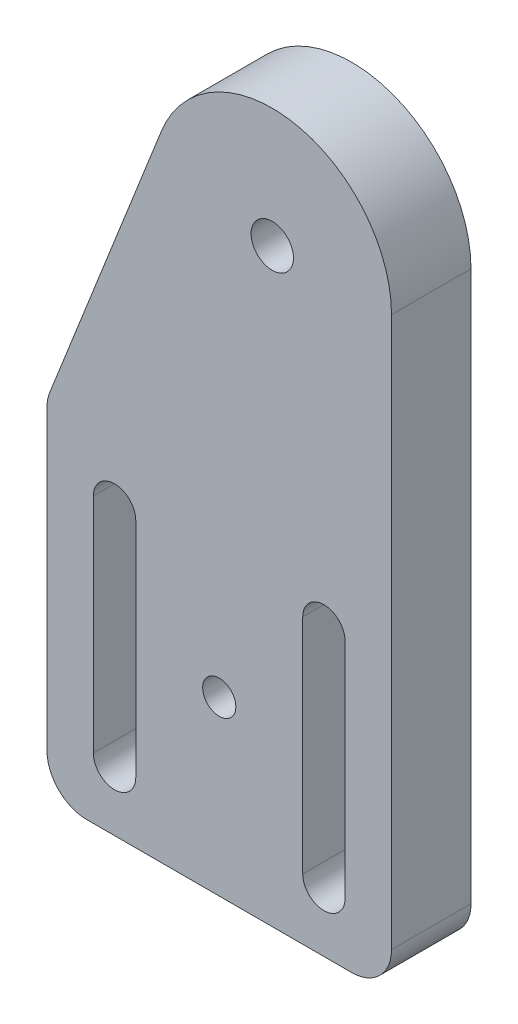
ISO-10303-21;
HEADER;
FILE_DESCRIPTION(('STEP AP214'),'2;1');
FILE_NAME('part.step','',(''),(''),'','','');
FILE_SCHEMA(('AUTOMOTIVE_DESIGN { 1 0 10303 214 1 1 1 1 }'));
ENDSEC;
DATA;
#1=APPLICATION_CONTEXT('core data for automotive mechanical design processes');
#2=APPLICATION_PROTOCOL_DEFINITION('international standard','automotive_design',2000,#1);
#3=PRODUCT_CONTEXT('',#1,'mechanical');
#4=PRODUCT('Part','Part','',(#3));
#5=PRODUCT_RELATED_PRODUCT_CATEGORY('part','',(#4));
#6=PRODUCT_DEFINITION_FORMATION('','',#4);
#7=PRODUCT_DEFINITION_CONTEXT('part definition',#1,'design');
#8=PRODUCT_DEFINITION('design','',#6,#7);
#9=PRODUCT_DEFINITION_SHAPE('','',#8);
#10=(LENGTH_UNIT() NAMED_UNIT(*) SI_UNIT(.MILLI.,.METRE.));
#11=(NAMED_UNIT(*) PLANE_ANGLE_UNIT() SI_UNIT($,.RADIAN.));
#12=(NAMED_UNIT(*) SI_UNIT($,.STERADIAN.) SOLID_ANGLE_UNIT());
#13=UNCERTAINTY_MEASURE_WITH_UNIT(LENGTH_MEASURE(1.E-05),#10,'distance_accuracy_value','');
#14=(GEOMETRIC_REPRESENTATION_CONTEXT(3) GLOBAL_UNCERTAINTY_ASSIGNED_CONTEXT((#13)) GLOBAL_UNIT_ASSIGNED_CONTEXT((#10,
#11,#12)) REPRESENTATION_CONTEXT('',''));
#15=CARTESIAN_POINT('',(0.,0.,0.));
#16=DIRECTION('',(0.,0.,1.));
#17=DIRECTION('',(1.,0.,0.));
#18=AXIS2_PLACEMENT_3D('',#15,#16,#17);
#19=CARTESIAN_POINT('',(4.,0.,6.));
#20=DIRECTION('',(0.,0.,-1.));
#21=DIRECTION('',(-1.,0.,0.));
#22=AXIS2_PLACEMENT_3D('',#19,#20,#21);
#23=PLANE('',#22);
#24=CARTESIAN_POINT('',(4.,0.,6.));
#25=DIRECTION('',(0.,0.,1.));
#26=DIRECTION('',(1.,0.,0.));
#27=AXIS2_PLACEMENT_3D('',#24,#25,#26);
#28=CIRCLE('',#27,1.6);
#29=CARTESIAN_POINT('',(5.6,0.,6.));
#30=VERTEX_POINT('',#29);
#31=EDGE_CURVE('E576',#30,#30,#28,.T.);
#32=ORIENTED_EDGE('',*,*,#31,.F.);
#33=EDGE_LOOP('',(#32));
#34=FACE_BOUND('',#33,.T.);
#35=CARTESIAN_POINT('',(0.,-31.5,6.));
#36=DIRECTION('',(0.,0.,1.));
#37=DIRECTION('',(1.,0.,0.));
#38=AXIS2_PLACEMENT_3D('',#35,#36,#37);
#39=CIRCLE('',#38,1.25);
#40=CARTESIAN_POINT('',(1.25,-31.5,6.));
#41=VERTEX_POINT('',#40);
#42=EDGE_CURVE('E580',#41,#41,#39,.T.);
#43=ORIENTED_EDGE('',*,*,#42,.F.);
#44=EDGE_LOOP('',(#43));
#45=FACE_BOUND('',#44,.T.);
#46=CARTESIAN_POINT('',(-7.9,-23.1,6.));
#47=DIRECTION('',(0.,0.,1.));
#48=DIRECTION('',(1.,0.,0.));
#49=AXIS2_PLACEMENT_3D('',#46,#47,#48);
#50=CIRCLE('',#49,1.6);
#51=CARTESIAN_POINT('',(-6.3,-23.1,6.));
#52=VERTEX_POINT('',#51);
#53=CARTESIAN_POINT('',(-9.5,-23.1,6.));
#54=VERTEX_POINT('',#53);
#55=EDGE_CURVE('E255',#52,#54,#50,.T.);
#56=ORIENTED_EDGE('',*,*,#55,.F.);
#57=DIRECTION('',(0.,-1.,0.));
#58=VECTOR('',#57,1.);
#59=CARTESIAN_POINT('',(-6.3,-23.1,6.));
#60=LINE('',#59,#58);
#61=CARTESIAN_POINT('',(-6.3,-39.9,6.));
#62=VERTEX_POINT('',#61);
#63=EDGE_CURVE('E263',#52,#62,#60,.T.);
#64=ORIENTED_EDGE('',*,*,#63,.T.);
#65=CARTESIAN_POINT('',(-7.9,-39.9,6.));
#66=DIRECTION('',(0.,0.,1.));
#67=DIRECTION('',(1.,0.,0.));
#68=AXIS2_PLACEMENT_3D('',#65,#66,#67);
#69=CIRCLE('',#68,1.6);
#70=CARTESIAN_POINT('',(-9.5,-39.9,6.));
#71=VERTEX_POINT('',#70);
#72=EDGE_CURVE('E260',#71,#62,#69,.T.);
#73=ORIENTED_EDGE('',*,*,#72,.F.);
#74=DIRECTION('',(0.,-1.,0.));
#75=VECTOR('',#74,1.);
#76=CARTESIAN_POINT('',(-9.5,-23.1,6.));
#77=LINE('',#76,#75);
#78=EDGE_CURVE('E257',#54,#71,#77,.T.);
#79=ORIENTED_EDGE('',*,*,#78,.F.);
#80=EDGE_LOOP('',(#56,#64,#73,#79));
#81=FACE_BOUND('',#80,.T.);
#82=DIRECTION('',(-1.,0.,0.));
#83=VECTOR('',#82,1.);
#84=CARTESIAN_POINT('',(13.,-44.5,6.));
#85=LINE('',#84,#83);
#86=CARTESIAN_POINT('',(10.,-44.5,6.));
#87=VERTEX_POINT('',#86);
#88=CARTESIAN_POINT('',(-9.99999999999999,-44.5,6.));
#89=VERTEX_POINT('',#88);
#90=EDGE_CURVE('E290',#87,#89,#85,.T.);
#91=ORIENTED_EDGE('',*,*,#90,.F.);
#92=CARTESIAN_POINT('',(10.,-41.5,6.));
#93=DIRECTION('',(0.,0.,-1.));
#94=DIRECTION('',(-1.,0.,0.));
#95=AXIS2_PLACEMENT_3D('',#92,#93,#94);
#96=CIRCLE('',#95,3.);
#97=CARTESIAN_POINT('',(13.,-41.5,6.));
#98=VERTEX_POINT('',#97);
#99=EDGE_CURVE('E335',#87,#98,#96,.F.);
#100=ORIENTED_EDGE('',*,*,#99,.T.);
#101=DIRECTION('',(0.,-1.,0.));
#102=VECTOR('',#101,1.);
#103=CARTESIAN_POINT('',(13.,-18.5,6.));
#104=LINE('',#103,#102);
#105=CARTESIAN_POINT('',(13.,0.,6.));
#106=VERTEX_POINT('',#105);
#107=EDGE_CURVE('E287',#106,#98,#104,.T.);
#108=ORIENTED_EDGE('',*,*,#107,.F.);
#109=CARTESIAN_POINT('',(4.,0.,6.));
#110=DIRECTION('',(0.,0.,-1.));
#111=DIRECTION('',(-1.,0.,0.));
#112=AXIS2_PLACEMENT_3D('',#109,#110,#111);
#113=CIRCLE('',#112,9.);
#114=CARTESIAN_POINT('',(-4.36856786884972,3.31165696056461,6.));
#115=VERTEX_POINT('',#114);
#116=EDGE_CURVE('E298',#115,#106,#113,.T.);
#117=ORIENTED_EDGE('',*,*,#116,.F.);
#118=DIRECTION('',(0.367961884507179,0.929840874316636,0.));
#119=VECTOR('',#118,1.);
#120=CARTESIAN_POINT('',(-13.,-18.5,6.));
#121=LINE('',#120,#119);
#122=CARTESIAN_POINT('',(-12.7895226229499,-17.9681229862646,6.));
#123=VERTEX_POINT('',#122);
#124=EDGE_CURVE('E296',#123,#115,#121,.T.);
#125=ORIENTED_EDGE('',*,*,#124,.F.);
#126=CARTESIAN_POINT('',(-10.,-19.0720086397861,6.));
#127=DIRECTION('',(0.,0.,-1.));
#128=DIRECTION('',(-1.,0.,0.));
#129=AXIS2_PLACEMENT_3D('',#126,#127,#128);
#130=CIRCLE('',#129,3.);
#131=CARTESIAN_POINT('',(-13.,-19.0720086397861,6.));
#132=VERTEX_POINT('',#131);
#133=EDGE_CURVE('E113',#123,#132,#130,.F.);
#134=ORIENTED_EDGE('',*,*,#133,.T.);
#135=DIRECTION('',(0.,1.,0.));
#136=VECTOR('',#135,1.);
#137=CARTESIAN_POINT('',(-13.,-44.5,6.));
#138=LINE('',#137,#136);
#139=CARTESIAN_POINT('',(-13.,-41.5,6.));
#140=VERTEX_POINT('',#139);
#141=EDGE_CURVE('E294',#140,#132,#138,.T.);
#142=ORIENTED_EDGE('',*,*,#141,.F.);
#143=CARTESIAN_POINT('',(-10.,-41.5,6.));
#144=DIRECTION('',(0.,0.,-1.));
#145=DIRECTION('',(-1.,0.,0.));
#146=AXIS2_PLACEMENT_3D('',#143,#144,#145);
#147=CIRCLE('',#146,3.);
#148=EDGE_CURVE('E333',#140,#89,#147,.F.);
#149=ORIENTED_EDGE('',*,*,#148,.T.);
#150=EDGE_LOOP('',(#91,#100,#108,#117,#125,#134,#142,#149));
#151=FACE_BOUND('',#150,.T.);
#152=CARTESIAN_POINT('',(7.9,-23.1,6.));
#153=DIRECTION('',(0.,0.,1.));
#154=DIRECTION('',(1.,0.,0.));
#155=AXIS2_PLACEMENT_3D('',#152,#153,#154);
#156=CIRCLE('',#155,1.6);
#157=CARTESIAN_POINT('',(9.5,-23.1,6.));
#158=VERTEX_POINT('',#157);
#159=CARTESIAN_POINT('',(6.3,-23.1,6.));
#160=VERTEX_POINT('',#159);
#161=EDGE_CURVE('E211',#158,#160,#156,.T.);
#162=ORIENTED_EDGE('',*,*,#161,.F.);
#163=DIRECTION('',(0.,-1.,0.));
#164=VECTOR('',#163,1.);
#165=CARTESIAN_POINT('',(9.5,-23.1,6.));
#166=LINE('',#165,#164);
#167=CARTESIAN_POINT('',(9.5,-39.9,6.));
#168=VERTEX_POINT('',#167);
#169=EDGE_CURVE('E237',#158,#168,#166,.T.);
#170=ORIENTED_EDGE('',*,*,#169,.T.);
#171=CARTESIAN_POINT('',(7.9,-39.9,6.));
#172=DIRECTION('',(0.,0.,1.));
#173=DIRECTION('',(1.,0.,0.));
#174=AXIS2_PLACEMENT_3D('',#171,#172,#173);
#175=CIRCLE('',#174,1.6);
#176=CARTESIAN_POINT('',(6.3,-39.9,6.));
#177=VERTEX_POINT('',#176);
#178=EDGE_CURVE('E235',#177,#168,#175,.T.);
#179=ORIENTED_EDGE('',*,*,#178,.F.);
#180=DIRECTION('',(0.,-1.,0.));
#181=VECTOR('',#180,1.);
#182=CARTESIAN_POINT('',(6.3,-23.1,6.));
#183=LINE('',#182,#181);
#184=EDGE_CURVE('E222',#160,#177,#183,.T.);
#185=ORIENTED_EDGE('',*,*,#184,.F.);
#186=EDGE_LOOP('',(#162,#170,#179,#185));
#187=FACE_BOUND('',#186,.T.);
#188=ADVANCED_FACE('F98',(#34,#45,#81,#151,#187),#23,.F.);
#189=CARTESIAN_POINT('',(4.,0.,0.));
#190=DIRECTION('',(0.,0.,-1.));
#191=DIRECTION('',(-1.,0.,0.));
#192=AXIS2_PLACEMENT_3D('',#189,#190,#191);
#193=PLANE('',#192);
#194=CARTESIAN_POINT('',(0.,-31.5,0.));
#195=DIRECTION('',(0.,0.,1.));
#196=DIRECTION('',(1.,0.,0.));
#197=AXIS2_PLACEMENT_3D('',#194,#195,#196);
#198=CIRCLE('',#197,1.25);
#199=CARTESIAN_POINT('',(1.25,-31.5,0.));
#200=VERTEX_POINT('',#199);
#201=EDGE_CURVE('E583',#200,#200,#198,.T.);
#202=ORIENTED_EDGE('',*,*,#201,.T.);
#203=EDGE_LOOP('',(#202));
#204=FACE_BOUND('',#203,.T.);
#205=CARTESIAN_POINT('',(4.,0.,0.));
#206=DIRECTION('',(0.,0.,1.));
#207=DIRECTION('',(1.,0.,0.));
#208=AXIS2_PLACEMENT_3D('',#205,#206,#207);
#209=CIRCLE('',#208,3.);
#210=CARTESIAN_POINT('',(7.,0.,0.));
#211=VERTEX_POINT('',#210);
#212=EDGE_CURVE('E589',#211,#211,#209,.T.);
#213=ORIENTED_EDGE('',*,*,#212,.T.);
#214=EDGE_LOOP('',(#213));
#215=FACE_BOUND('',#214,.T.);
#216=DIRECTION('',(0.,1.,0.));
#217=VECTOR('',#216,1.);
#218=CARTESIAN_POINT('',(13.,-18.5,0.));
#219=LINE('',#218,#217);
#220=CARTESIAN_POINT('',(13.,-41.5,0.));
#221=VERTEX_POINT('',#220);
#222=CARTESIAN_POINT('',(13.,0.,0.));
#223=VERTEX_POINT('',#222);
#224=EDGE_CURVE('E291',#221,#223,#219,.T.);
#225=ORIENTED_EDGE('',*,*,#224,.F.);
#226=CARTESIAN_POINT('',(10.,-41.5,0.));
#227=DIRECTION('',(0.,0.,-1.));
#228=DIRECTION('',(-1.,0.,0.));
#229=AXIS2_PLACEMENT_3D('',#226,#227,#228);
#230=CIRCLE('',#229,3.);
#231=CARTESIAN_POINT('',(10.,-44.5,0.));
#232=VERTEX_POINT('',#231);
#233=EDGE_CURVE('E325',#221,#232,#230,.T.);
#234=ORIENTED_EDGE('',*,*,#233,.T.);
#235=DIRECTION('',(-1.,0.,0.));
#236=VECTOR('',#235,1.);
#237=CARTESIAN_POINT('',(13.,-44.5,0.));
#238=LINE('',#237,#236);
#239=CARTESIAN_POINT('',(-9.99999999999999,-44.5,0.));
#240=VERTEX_POINT('',#239);
#241=EDGE_CURVE('E286',#232,#240,#238,.T.);
#242=ORIENTED_EDGE('',*,*,#241,.T.);
#243=CARTESIAN_POINT('',(-10.,-41.5,0.));
#244=DIRECTION('',(0.,0.,-1.));
#245=DIRECTION('',(-1.,0.,0.));
#246=AXIS2_PLACEMENT_3D('',#243,#244,#245);
#247=CIRCLE('',#246,3.);
#248=CARTESIAN_POINT('',(-13.,-41.5,0.));
#249=VERTEX_POINT('',#248);
#250=EDGE_CURVE('E323',#240,#249,#247,.T.);
#251=ORIENTED_EDGE('',*,*,#250,.T.);
#252=DIRECTION('',(0.,1.,0.));
#253=VECTOR('',#252,1.);
#254=CARTESIAN_POINT('',(-13.,-44.5,0.));
#255=LINE('',#254,#253);
#256=CARTESIAN_POINT('',(-13.,-19.0720086397861,0.));
#257=VERTEX_POINT('',#256);
#258=EDGE_CURVE('E304',#249,#257,#255,.T.);
#259=ORIENTED_EDGE('',*,*,#258,.T.);
#260=CARTESIAN_POINT('',(-10.,-19.0720086397861,0.));
#261=DIRECTION('',(0.,0.,-1.));
#262=DIRECTION('',(-1.,0.,0.));
#263=AXIS2_PLACEMENT_3D('',#260,#261,#262);
#264=CIRCLE('',#263,3.);
#265=CARTESIAN_POINT('',(-12.7895226229499,-17.9681229862646,0.));
#266=VERTEX_POINT('',#265);
#267=EDGE_CURVE('E321',#257,#266,#264,.T.);
#268=ORIENTED_EDGE('',*,*,#267,.T.);
#269=DIRECTION('',(0.367961884507179,0.929840874316636,0.));
#270=VECTOR('',#269,1.);
#271=CARTESIAN_POINT('',(-13.,-18.5,0.));
#272=LINE('',#271,#270);
#273=CARTESIAN_POINT('',(-4.36856786884972,3.31165696056461,0.));
#274=VERTEX_POINT('',#273);
#275=EDGE_CURVE('E307',#266,#274,#272,.T.);
#276=ORIENTED_EDGE('',*,*,#275,.T.);
#277=CARTESIAN_POINT('',(4.,0.,0.));
#278=DIRECTION('',(0.,0.,-1.));
#279=DIRECTION('',(-1.,0.,0.));
#280=AXIS2_PLACEMENT_3D('',#277,#278,#279);
#281=CIRCLE('',#280,9.);
#282=EDGE_CURVE('E309',#274,#223,#281,.T.);
#283=ORIENTED_EDGE('',*,*,#282,.T.);
#284=EDGE_LOOP('',(#225,#234,#242,#251,#259,#268,#276,#283));
#285=FACE_BOUND('',#284,.T.);
#286=DIRECTION('',(0.,-1.,0.));
#287=VECTOR('',#286,1.);
#288=CARTESIAN_POINT('',(-6.3,-23.1,0.));
#289=LINE('',#288,#287);
#290=CARTESIAN_POINT('',(-6.3,-23.1,0.));
#291=VERTEX_POINT('',#290);
#292=CARTESIAN_POINT('',(-6.3,-39.9,0.));
#293=VERTEX_POINT('',#292);
#294=EDGE_CURVE('E258',#291,#293,#289,.T.);
#295=ORIENTED_EDGE('',*,*,#294,.F.);
#296=CARTESIAN_POINT('',(-7.9,-23.1,0.));
#297=DIRECTION('',(0.,0.,1.));
#298=DIRECTION('',(1.,0.,0.));
#299=AXIS2_PLACEMENT_3D('',#296,#297,#298);
#300=CIRCLE('',#299,1.6);
#301=CARTESIAN_POINT('',(-9.5,-23.1,0.));
#302=VERTEX_POINT('',#301);
#303=EDGE_CURVE('E230',#291,#302,#300,.T.);
#304=ORIENTED_EDGE('',*,*,#303,.T.);
#305=DIRECTION('',(0.,-1.,0.));
#306=VECTOR('',#305,1.);
#307=CARTESIAN_POINT('',(-9.5,-23.1,0.));
#308=LINE('',#307,#306);
#309=CARTESIAN_POINT('',(-9.5,-39.9,0.));
#310=VERTEX_POINT('',#309);
#311=EDGE_CURVE('E269',#302,#310,#308,.T.);
#312=ORIENTED_EDGE('',*,*,#311,.T.);
#313=CARTESIAN_POINT('',(-7.9,-39.9,0.));
#314=DIRECTION('',(0.,0.,1.));
#315=DIRECTION('',(1.,0.,0.));
#316=AXIS2_PLACEMENT_3D('',#313,#314,#315);
#317=CIRCLE('',#316,1.6);
#318=EDGE_CURVE('E272',#310,#293,#317,.T.);
#319=ORIENTED_EDGE('',*,*,#318,.T.);
#320=EDGE_LOOP('',(#295,#304,#312,#319));
#321=FACE_BOUND('',#320,.T.);
#322=DIRECTION('',(0.,-1.,0.));
#323=VECTOR('',#322,1.);
#324=CARTESIAN_POINT('',(9.5,-23.1,0.));
#325=LINE('',#324,#323);
#326=CARTESIAN_POINT('',(9.5,-23.1,0.));
#327=VERTEX_POINT('',#326);
#328=CARTESIAN_POINT('',(9.5,-39.9,0.));
#329=VERTEX_POINT('',#328);
#330=EDGE_CURVE('E223',#327,#329,#325,.T.);
#331=ORIENTED_EDGE('',*,*,#330,.F.);
#332=CARTESIAN_POINT('',(7.9,-23.1,0.));
#333=DIRECTION('',(0.,0.,1.));
#334=DIRECTION('',(1.,0.,0.));
#335=AXIS2_PLACEMENT_3D('',#332,#333,#334);
#336=CIRCLE('',#335,1.6);
#337=CARTESIAN_POINT('',(6.3,-23.1,0.));
#338=VERTEX_POINT('',#337);
#339=EDGE_CURVE('E242',#327,#338,#336,.T.);
#340=ORIENTED_EDGE('',*,*,#339,.T.);
#341=DIRECTION('',(0.,-1.,0.));
#342=VECTOR('',#341,1.);
#343=CARTESIAN_POINT('',(6.3,-23.1,0.));
#344=LINE('',#343,#342);
#345=CARTESIAN_POINT('',(6.3,-39.9,0.));
#346=VERTEX_POINT('',#345);
#347=EDGE_CURVE('E229',#338,#346,#344,.T.);
#348=ORIENTED_EDGE('',*,*,#347,.T.);
#349=CARTESIAN_POINT('',(7.9,-39.9,0.));
#350=DIRECTION('',(0.,0.,1.));
#351=DIRECTION('',(1.,0.,0.));
#352=AXIS2_PLACEMENT_3D('',#349,#350,#351);
#353=CIRCLE('',#352,1.6);
#354=EDGE_CURVE('E246',#346,#329,#353,.T.);
#355=ORIENTED_EDGE('',*,*,#354,.T.);
#356=EDGE_LOOP('',(#331,#340,#348,#355));
#357=FACE_BOUND('',#356,.T.);
#358=ADVANCED_FACE('F344',(#204,#215,#285,#321,#357),#193,.T.);
#359=CARTESIAN_POINT('',(13.,-18.5,6.));
#360=DIRECTION('',(-1.,0.,0.));
#361=DIRECTION('',(0.,-1.,0.));
#362=AXIS2_PLACEMENT_3D('',#359,#360,#361);
#363=PLANE('',#362);
#364=ORIENTED_EDGE('',*,*,#107,.T.);
#365=DIRECTION('',(0.,0.,-1.));
#366=VECTOR('',#365,1.);
#367=CARTESIAN_POINT('',(13.,-41.5,0.));
#368=LINE('',#367,#366);
#369=EDGE_CURVE('E316',#98,#221,#368,.T.);
#370=ORIENTED_EDGE('',*,*,#369,.T.);
#371=ORIENTED_EDGE('',*,*,#224,.T.);
#372=DIRECTION('',(0.,0.,-1.));
#373=VECTOR('',#372,1.);
#374=CARTESIAN_POINT('',(13.,0.,6.));
#375=LINE('',#374,#373);
#376=EDGE_CURVE('E313',#106,#223,#375,.T.);
#377=ORIENTED_EDGE('',*,*,#376,.F.);
#378=EDGE_LOOP('',(#364,#370,#371,#377));
#379=FACE_BOUND('',#378,.T.);
#380=ADVANCED_FACE('F361',(#379),#363,.F.);
#381=CARTESIAN_POINT('',(4.,0.,6.));
#382=DIRECTION('',(0.,0.,-1.));
#383=DIRECTION('',(-1.,0.,0.));
#384=AXIS2_PLACEMENT_3D('',#381,#382,#383);
#385=CYLINDRICAL_SURFACE('',#384,9.);
#386=ORIENTED_EDGE('',*,*,#282,.F.);
#387=DIRECTION('',(0.,0.,-1.));
#388=VECTOR('',#387,1.);
#389=CARTESIAN_POINT('',(-4.36856786884972,3.31165696056461,6.));
#390=LINE('',#389,#388);
#391=EDGE_CURVE('E301',#115,#274,#390,.T.);
#392=ORIENTED_EDGE('',*,*,#391,.F.);
#393=ORIENTED_EDGE('',*,*,#116,.T.);
#394=ORIENTED_EDGE('',*,*,#376,.T.);
#395=EDGE_LOOP('',(#386,#392,#393,#394));
#396=FACE_BOUND('',#395,.T.);
#397=ADVANCED_FACE('F366',(#396),#385,.T.);
#398=CARTESIAN_POINT('',(-13.,-18.5,6.));
#399=DIRECTION('',(-0.929840874316636,0.367961884507179,0.));
#400=DIRECTION('',(-0.367961884507179,-0.929840874316636,0.));
#401=AXIS2_PLACEMENT_3D('',#398,#399,#400);
#402=PLANE('',#401);
#403=ORIENTED_EDGE('',*,*,#275,.F.);
#404=DIRECTION('',(0.,0.,-1.));
#405=VECTOR('',#404,1.);
#406=CARTESIAN_POINT('',(-12.7895226229499,-17.9681229862646,6.));
#407=LINE('',#406,#405);
#408=EDGE_CURVE('E12',#266,#123,#407,.F.);
#409=ORIENTED_EDGE('',*,*,#408,.T.);
#410=ORIENTED_EDGE('',*,*,#124,.T.);
#411=ORIENTED_EDGE('',*,*,#391,.T.);
#412=EDGE_LOOP('',(#403,#409,#410,#411));
#413=FACE_BOUND('',#412,.T.);
#414=ADVANCED_FACE('F370',(#413),#402,.T.);
#415=CARTESIAN_POINT('',(-13.,-44.5,6.));
#416=DIRECTION('',(-1.,0.,0.));
#417=DIRECTION('',(0.,-1.,0.));
#418=AXIS2_PLACEMENT_3D('',#415,#416,#417);
#419=PLANE('',#418);
#420=ORIENTED_EDGE('',*,*,#258,.F.);
#421=DIRECTION('',(0.,0.,-1.));
#422=VECTOR('',#421,1.);
#423=CARTESIAN_POINT('',(-13.,-41.5,6.));
#424=LINE('',#423,#422);
#425=EDGE_CURVE('E106',#249,#140,#424,.F.);
#426=ORIENTED_EDGE('',*,*,#425,.T.);
#427=ORIENTED_EDGE('',*,*,#141,.T.);
#428=DIRECTION('',(0.,0.,-1.));
#429=VECTOR('',#428,1.);
#430=CARTESIAN_POINT('',(-13.,-19.0720086397861,6.));
#431=LINE('',#430,#429);
#432=EDGE_CURVE('E337',#132,#257,#431,.T.);
#433=ORIENTED_EDGE('',*,*,#432,.T.);
#434=EDGE_LOOP('',(#420,#426,#427,#433));
#435=FACE_BOUND('',#434,.T.);
#436=ADVANCED_FACE('F340',(#435),#419,.T.);
#437=CARTESIAN_POINT('',(13.,-44.5,6.));
#438=DIRECTION('',(0.,-1.,0.));
#439=DIRECTION('',(1.,0.,0.));
#440=AXIS2_PLACEMENT_3D('',#437,#438,#439);
#441=PLANE('',#440);
#442=ORIENTED_EDGE('',*,*,#241,.F.);
#443=DIRECTION('',(0.,0.,-1.));
#444=VECTOR('',#443,1.);
#445=CARTESIAN_POINT('',(10.,-44.5,6.));
#446=LINE('',#445,#444);
#447=EDGE_CURVE('E330',#232,#87,#446,.F.);
#448=ORIENTED_EDGE('',*,*,#447,.T.);
#449=ORIENTED_EDGE('',*,*,#90,.T.);
#450=DIRECTION('',(0.,0.,-1.));
#451=VECTOR('',#450,1.);
#452=CARTESIAN_POINT('',(-10.,-44.5,6.));
#453=LINE('',#452,#451);
#454=EDGE_CURVE('E327',#89,#240,#453,.T.);
#455=ORIENTED_EDGE('',*,*,#454,.T.);
#456=EDGE_LOOP('',(#442,#448,#449,#455));
#457=FACE_BOUND('',#456,.T.);
#458=ADVANCED_FACE('F353',(#457),#441,.T.);
#459=CARTESIAN_POINT('',(-7.9,-23.1,6.));
#460=DIRECTION('',(0.,0.,-1.));
#461=DIRECTION('',(-1.,0.,0.));
#462=AXIS2_PLACEMENT_3D('',#459,#460,#461);
#463=CYLINDRICAL_SURFACE('',#462,1.6);
#464=ORIENTED_EDGE('',*,*,#303,.F.);
#465=DIRECTION('',(0.,0.,-1.));
#466=VECTOR('',#465,1.);
#467=CARTESIAN_POINT('',(-6.3,-23.1,6.));
#468=LINE('',#467,#466);
#469=EDGE_CURVE('E266',#52,#291,#468,.T.);
#470=ORIENTED_EDGE('',*,*,#469,.F.);
#471=ORIENTED_EDGE('',*,*,#55,.T.);
#472=DIRECTION('',(0.,0.,-1.));
#473=VECTOR('',#472,1.);
#474=CARTESIAN_POINT('',(-9.5,-23.1,6.));
#475=LINE('',#474,#473);
#476=EDGE_CURVE('E283',#54,#302,#475,.T.);
#477=ORIENTED_EDGE('',*,*,#476,.T.);
#478=EDGE_LOOP('',(#464,#470,#471,#477));
#479=FACE_BOUND('',#478,.T.);
#480=ADVANCED_FACE('F390',(#479),#463,.F.);
#481=CARTESIAN_POINT('',(-9.5,-23.1,6.));
#482=DIRECTION('',(1.,0.,0.));
#483=DIRECTION('',(0.,0.,-1.));
#484=AXIS2_PLACEMENT_3D('',#481,#482,#483);
#485=PLANE('',#484);
#486=ORIENTED_EDGE('',*,*,#311,.F.);
#487=ORIENTED_EDGE('',*,*,#476,.F.);
#488=ORIENTED_EDGE('',*,*,#78,.T.);
#489=DIRECTION('',(0.,0.,-1.));
#490=VECTOR('',#489,1.);
#491=CARTESIAN_POINT('',(-9.5,-39.9,6.));
#492=LINE('',#491,#490);
#493=EDGE_CURVE('E281',#71,#310,#492,.T.);
#494=ORIENTED_EDGE('',*,*,#493,.T.);
#495=EDGE_LOOP('',(#486,#487,#488,#494));
#496=FACE_BOUND('',#495,.T.);
#497=ADVANCED_FACE('F412',(#496),#485,.T.);
#498=CARTESIAN_POINT('',(-7.9,-39.9,6.));
#499=DIRECTION('',(0.,0.,-1.));
#500=DIRECTION('',(-1.,0.,0.));
#501=AXIS2_PLACEMENT_3D('',#498,#499,#500);
#502=CYLINDRICAL_SURFACE('',#501,1.6);
#503=ORIENTED_EDGE('',*,*,#318,.F.);
#504=ORIENTED_EDGE('',*,*,#493,.F.);
#505=ORIENTED_EDGE('',*,*,#72,.T.);
#506=DIRECTION('',(0.,0.,-1.));
#507=VECTOR('',#506,1.);
#508=CARTESIAN_POINT('',(-6.3,-39.9,6.));
#509=LINE('',#508,#507);
#510=EDGE_CURVE('E279',#62,#293,#509,.T.);
#511=ORIENTED_EDGE('',*,*,#510,.T.);
#512=EDGE_LOOP('',(#503,#504,#505,#511));
#513=FACE_BOUND('',#512,.T.);
#514=ADVANCED_FACE('F423',(#513),#502,.F.);
#515=CARTESIAN_POINT('',(-6.3,-23.1,6.));
#516=DIRECTION('',(1.,0.,0.));
#517=DIRECTION('',(0.,0.,-1.));
#518=AXIS2_PLACEMENT_3D('',#515,#516,#517);
#519=PLANE('',#518);
#520=ORIENTED_EDGE('',*,*,#294,.T.);
#521=ORIENTED_EDGE('',*,*,#510,.F.);
#522=ORIENTED_EDGE('',*,*,#63,.F.);
#523=ORIENTED_EDGE('',*,*,#469,.T.);
#524=EDGE_LOOP('',(#520,#521,#522,#523));
#525=FACE_BOUND('',#524,.T.);
#526=ADVANCED_FACE('F432',(#525),#519,.F.);
#527=CARTESIAN_POINT('',(7.9,-23.1,6.));
#528=DIRECTION('',(0.,0.,-1.));
#529=DIRECTION('',(-1.,0.,0.));
#530=AXIS2_PLACEMENT_3D('',#527,#528,#529);
#531=CYLINDRICAL_SURFACE('',#530,1.6);
#532=ORIENTED_EDGE('',*,*,#339,.F.);
#533=DIRECTION('',(0.,0.,-1.));
#534=VECTOR('',#533,1.);
#535=CARTESIAN_POINT('',(9.5,-23.1,6.));
#536=LINE('',#535,#534);
#537=EDGE_CURVE('E217',#158,#327,#536,.T.);
#538=ORIENTED_EDGE('',*,*,#537,.F.);
#539=ORIENTED_EDGE('',*,*,#161,.T.);
#540=DIRECTION('',(0.,0.,-1.));
#541=VECTOR('',#540,1.);
#542=CARTESIAN_POINT('',(6.3,-23.1,6.));
#543=LINE('',#542,#541);
#544=EDGE_CURVE('E214',#160,#338,#543,.T.);
#545=ORIENTED_EDGE('',*,*,#544,.T.);
#546=EDGE_LOOP('',(#532,#538,#539,#545));
#547=FACE_BOUND('',#546,.T.);
#548=ADVANCED_FACE('F213',(#547),#531,.F.);
#549=CARTESIAN_POINT('',(6.3,-23.1,6.));
#550=DIRECTION('',(1.,0.,0.));
#551=DIRECTION('',(0.,0.,-1.));
#552=AXIS2_PLACEMENT_3D('',#549,#550,#551);
#553=PLANE('',#552);
#554=ORIENTED_EDGE('',*,*,#347,.F.);
#555=ORIENTED_EDGE('',*,*,#544,.F.);
#556=ORIENTED_EDGE('',*,*,#184,.T.);
#557=DIRECTION('',(0.,0.,-1.));
#558=VECTOR('',#557,1.);
#559=CARTESIAN_POINT('',(6.3,-39.9,6.));
#560=LINE('',#559,#558);
#561=EDGE_CURVE('E231',#177,#346,#560,.T.);
#562=ORIENTED_EDGE('',*,*,#561,.T.);
#563=EDGE_LOOP('',(#554,#555,#556,#562));
#564=FACE_BOUND('',#563,.T.);
#565=ADVANCED_FACE('F226',(#564),#553,.T.);
#566=CARTESIAN_POINT('',(7.9,-39.9,6.));
#567=DIRECTION('',(0.,0.,-1.));
#568=DIRECTION('',(-1.,0.,0.));
#569=AXIS2_PLACEMENT_3D('',#566,#567,#568);
#570=CYLINDRICAL_SURFACE('',#569,1.6);
#571=ORIENTED_EDGE('',*,*,#354,.F.);
#572=ORIENTED_EDGE('',*,*,#561,.F.);
#573=ORIENTED_EDGE('',*,*,#178,.T.);
#574=DIRECTION('',(0.,0.,-1.));
#575=VECTOR('',#574,1.);
#576=CARTESIAN_POINT('',(9.5,-39.9,6.));
#577=LINE('',#576,#575);
#578=EDGE_CURVE('E252',#168,#329,#577,.T.);
#579=ORIENTED_EDGE('',*,*,#578,.T.);
#580=EDGE_LOOP('',(#571,#572,#573,#579));
#581=FACE_BOUND('',#580,.T.);
#582=ADVANCED_FACE('F459',(#581),#570,.F.);
#583=CARTESIAN_POINT('',(9.5,-23.1,6.));
#584=DIRECTION('',(1.,0.,0.));
#585=DIRECTION('',(0.,0.,-1.));
#586=AXIS2_PLACEMENT_3D('',#583,#584,#585);
#587=PLANE('',#586);
#588=ORIENTED_EDGE('',*,*,#330,.T.);
#589=ORIENTED_EDGE('',*,*,#578,.F.);
#590=ORIENTED_EDGE('',*,*,#169,.F.);
#591=ORIENTED_EDGE('',*,*,#537,.T.);
#592=EDGE_LOOP('',(#588,#589,#590,#591));
#593=FACE_BOUND('',#592,.T.);
#594=ADVANCED_FACE('F468',(#593),#587,.F.);
#595=CARTESIAN_POINT('',(4.,0.,3.));
#596=DIRECTION('',(0.,0.,-1.));
#597=DIRECTION('',(-1.,0.,0.));
#598=AXIS2_PLACEMENT_3D('',#595,#596,#597);
#599=CYLINDRICAL_SURFACE('',#598,3.);
#600=CARTESIAN_POINT('',(4.,0.,3.));
#601=DIRECTION('',(0.,0.,1.));
#602=DIRECTION('',(1.,0.,0.));
#603=AXIS2_PLACEMENT_3D('',#600,#601,#602);
#604=CIRCLE('',#603,3.);
#605=CARTESIAN_POINT('',(7.,0.,3.));
#606=VERTEX_POINT('',#605);
#607=EDGE_CURVE('E244',#606,#606,#604,.T.);
#608=ORIENTED_EDGE('',*,*,#607,.T.);
#609=EDGE_LOOP('',(#608));
#610=FACE_BOUND('',#609,.T.);
#611=ORIENTED_EDGE('',*,*,#212,.F.);
#612=EDGE_LOOP('',(#611));
#613=FACE_BOUND('',#612,.T.);
#614=ADVANCED_FACE('F478',(#610,#613),#599,.F.);
#615=CARTESIAN_POINT('',(4.,0.,3.));
#616=DIRECTION('',(0.,0.,1.));
#617=DIRECTION('',(1.,0.,0.));
#618=AXIS2_PLACEMENT_3D('',#615,#616,#617);
#619=PLANE('',#618);
#620=CARTESIAN_POINT('',(4.,0.,3.));
#621=DIRECTION('',(0.,0.,1.));
#622=DIRECTION('',(1.,0.,0.));
#623=AXIS2_PLACEMENT_3D('',#620,#621,#622);
#624=CIRCLE('',#623,1.6);
#625=CARTESIAN_POINT('',(5.6,0.,3.));
#626=VERTEX_POINT('',#625);
#627=EDGE_CURVE('E579',#626,#626,#624,.T.);
#628=ORIENTED_EDGE('',*,*,#627,.T.);
#629=EDGE_LOOP('',(#628));
#630=FACE_BOUND('',#629,.T.);
#631=ORIENTED_EDGE('',*,*,#607,.F.);
#632=EDGE_LOOP('',(#631));
#633=FACE_BOUND('',#632,.T.);
#634=ADVANCED_FACE('F488',(#630,#633),#619,.F.);
#635=CARTESIAN_POINT('',(0.,-31.5,6.));
#636=DIRECTION('',(0.,0.,1.));
#637=DIRECTION('',(1.,0.,0.));
#638=AXIS2_PLACEMENT_3D('',#635,#636,#637);
#639=CYLINDRICAL_SURFACE('',#638,1.25);
#640=ORIENTED_EDGE('',*,*,#201,.F.);
#641=EDGE_LOOP('',(#640));
#642=FACE_BOUND('',#641,.T.);
#643=ORIENTED_EDGE('',*,*,#42,.T.);
#644=EDGE_LOOP('',(#643));
#645=FACE_BOUND('',#644,.T.);
#646=ADVANCED_FACE('F496',(#642,#645),#639,.F.);
#647=CARTESIAN_POINT('',(4.,0.,6.));
#648=DIRECTION('',(0.,0.,1.));
#649=DIRECTION('',(1.,0.,0.));
#650=AXIS2_PLACEMENT_3D('',#647,#648,#649);
#651=CYLINDRICAL_SURFACE('',#650,1.6);
#652=ORIENTED_EDGE('',*,*,#31,.T.);
#653=EDGE_LOOP('',(#652));
#654=FACE_BOUND('',#653,.T.);
#655=ORIENTED_EDGE('',*,*,#627,.F.);
#656=EDGE_LOOP('',(#655));
#657=FACE_BOUND('',#656,.T.);
#658=ADVANCED_FACE('F502',(#654,#657),#651,.F.);
#659=CARTESIAN_POINT('',(10.,-41.5,6.));
#660=DIRECTION('',(0.,0.,1.));
#661=DIRECTION('',(1.,0.,0.));
#662=AXIS2_PLACEMENT_3D('',#659,#660,#661);
#663=CYLINDRICAL_SURFACE('',#662,3.);
#664=ORIENTED_EDGE('',*,*,#99,.F.);
#665=ORIENTED_EDGE('',*,*,#447,.F.);
#666=ORIENTED_EDGE('',*,*,#233,.F.);
#667=ORIENTED_EDGE('',*,*,#369,.F.);
#668=EDGE_LOOP('',(#664,#665,#666,#667));
#669=FACE_BOUND('',#668,.T.);
#670=ADVANCED_FACE('F359',(#669),#663,.T.);
#671=CARTESIAN_POINT('',(-10.,-41.5,6.));
#672=DIRECTION('',(0.,0.,-1.));
#673=DIRECTION('',(-1.,0.,0.));
#674=AXIS2_PLACEMENT_3D('',#671,#672,#673);
#675=CYLINDRICAL_SURFACE('',#674,3.);
#676=ORIENTED_EDGE('',*,*,#148,.F.);
#677=ORIENTED_EDGE('',*,*,#425,.F.);
#678=ORIENTED_EDGE('',*,*,#250,.F.);
#679=ORIENTED_EDGE('',*,*,#454,.F.);
#680=EDGE_LOOP('',(#676,#677,#678,#679));
#681=FACE_BOUND('',#680,.T.);
#682=ADVANCED_FACE('F351',(#681),#675,.T.);
#683=CARTESIAN_POINT('',(-10.,-19.0720086397861,6.));
#684=DIRECTION('',(0.,0.,-1.));
#685=DIRECTION('',(-1.,0.,0.));
#686=AXIS2_PLACEMENT_3D('',#683,#684,#685);
#687=CYLINDRICAL_SURFACE('',#686,3.);
#688=ORIENTED_EDGE('',*,*,#133,.F.);
#689=ORIENTED_EDGE('',*,*,#408,.F.);
#690=ORIENTED_EDGE('',*,*,#267,.F.);
#691=ORIENTED_EDGE('',*,*,#432,.F.);
#692=EDGE_LOOP('',(#688,#689,#690,#691));
#693=FACE_BOUND('',#692,.T.);
#694=ADVANCED_FACE('F100',(#693),#687,.T.);
#695=CLOSED_SHELL('',(#188,#358,#380,#397,#414,#436,#458,#480,#497,#514,#526,#548,#565,#582,
#594,#614,#634,#646,#658,#670,#682,#694));
#696=MANIFOLD_SOLID_BREP('B2',#695);
#697=ADVANCED_BREP_SHAPE_REPRESENTATION('',(#18,#696),#14);
#698=SHAPE_DEFINITION_REPRESENTATION(#9,#697);
ENDSEC;
END-ISO-10303-21;
